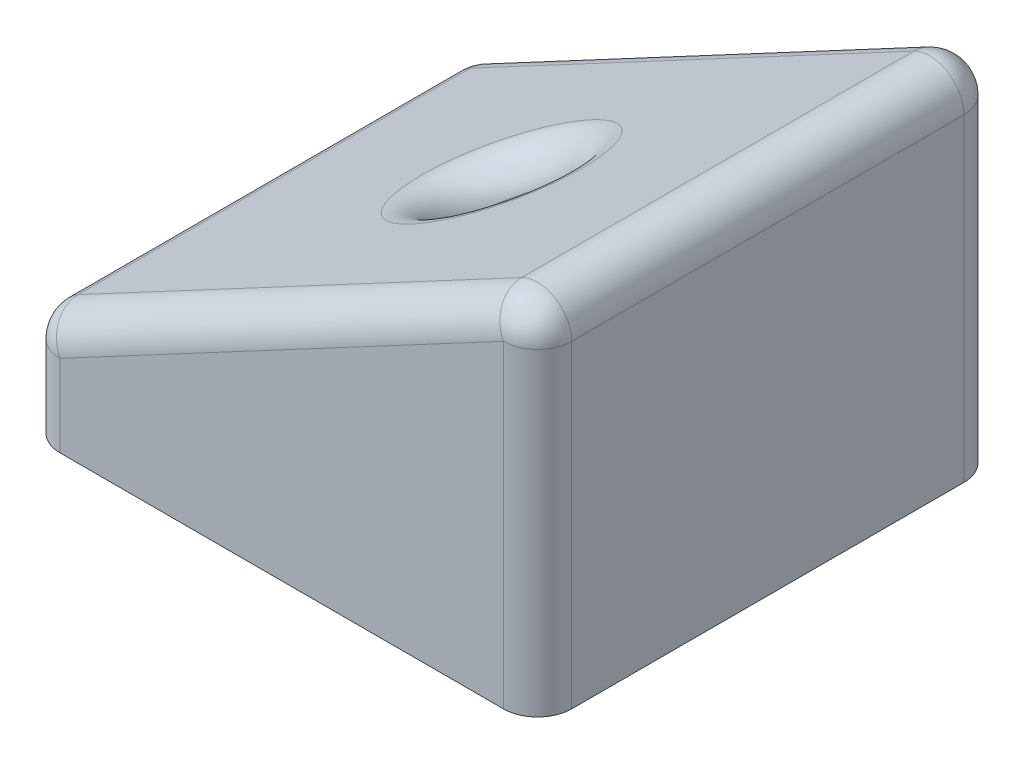
ISO-10303-21;
HEADER;
FILE_DESCRIPTION(('STEP AP214'),'2;1');
FILE_NAME('part.step','',(''),(''),'','','');
FILE_SCHEMA(('AUTOMOTIVE_DESIGN { 1 0 10303 214 1 1 1 1 }'));
ENDSEC;
DATA;
#1=APPLICATION_CONTEXT('core data for automotive mechanical design processes');
#2=APPLICATION_PROTOCOL_DEFINITION('international standard','automotive_design',2000,#1);
#3=PRODUCT_CONTEXT('',#1,'mechanical');
#4=PRODUCT('Part','Part','',(#3));
#5=PRODUCT_RELATED_PRODUCT_CATEGORY('part','',(#4));
#6=PRODUCT_DEFINITION_FORMATION('','',#4);
#7=PRODUCT_DEFINITION_CONTEXT('part definition',#1,'design');
#8=PRODUCT_DEFINITION('design','',#6,#7);
#9=PRODUCT_DEFINITION_SHAPE('','',#8);
#10=(LENGTH_UNIT() NAMED_UNIT(*) SI_UNIT(.MILLI.,.METRE.));
#11=(NAMED_UNIT(*) PLANE_ANGLE_UNIT() SI_UNIT($,.RADIAN.));
#12=(NAMED_UNIT(*) SI_UNIT($,.STERADIAN.) SOLID_ANGLE_UNIT());
#13=UNCERTAINTY_MEASURE_WITH_UNIT(LENGTH_MEASURE(1.E-05),#10,'distance_accuracy_value','');
#14=(GEOMETRIC_REPRESENTATION_CONTEXT(3) GLOBAL_UNCERTAINTY_ASSIGNED_CONTEXT((#13)) GLOBAL_UNIT_ASSIGNED_CONTEXT((#10,
#11,#12)) REPRESENTATION_CONTEXT('',''));
#15=CARTESIAN_POINT('',(0.,0.,0.));
#16=DIRECTION('',(0.,0.,1.));
#17=DIRECTION('',(1.,0.,0.));
#18=AXIS2_PLACEMENT_3D('',#15,#16,#17);
#19=CARTESIAN_POINT('',(23.4405380236702,-3.49837972070925,7.81491618480756));
#20=DIRECTION('',(0.,0.,-1.));
#21=DIRECTION('',(-1.,0.,0.));
#22=AXIS2_PLACEMENT_3D('',#19,#20,#21);
#23=PLANE('',#22);
#24=DIRECTION('',(0.882352941176471,0.470588235294118,0.));
#25=VECTOR('',#24,1.);
#26=CARTESIAN_POINT('',(18.0702958091373,6.57082443153988,7.81491618480756));
#27=LINE('',#26,#25);
#28=CARTESIAN_POINT('',(15.1077446567349,4.9907971502586,7.81491618480757));
#29=VERTEX_POINT('',#28);
#30=CARTESIAN_POINT('',(21.0328469615397,8.15085171282116,7.81491618480756));
#31=VERTEX_POINT('',#30);
#32=EDGE_CURVE('E157',#29,#31,#27,.T.);
#33=ORIENTED_EDGE('',*,*,#32,.F.);
#34=DIRECTION('',(-0.470588235294118,0.882352941176471,0.));
#35=VECTOR('',#34,1.);
#36=CARTESIAN_POINT('',(20.4779868712677,-5.07840700199054,7.81491618480757));
#37=LINE('',#36,#35);
#38=CARTESIAN_POINT('',(17.7695031368728,0.,7.81491618480757));
#39=VERTEX_POINT('',#38);
#40=EDGE_CURVE('E146',#39,#29,#37,.T.);
#41=ORIENTED_EDGE('',*,*,#40,.F.);
#42=DIRECTION('',(-1.,0.,0.));
#43=VECTOR('',#42,1.);
#44=CARTESIAN_POINT('',(0.,0.,7.81491618480752));
#45=LINE('',#44,#43);
#46=CARTESIAN_POINT('',(25.3799678750443,0.,7.81491618480756));
#47=VERTEX_POINT('',#46);
#48=EDGE_CURVE('E292',#47,#39,#45,.T.);
#49=ORIENTED_EDGE('',*,*,#48,.F.);
#50=DIRECTION('',(-0.470588235294118,0.882352941176471,0.));
#51=VECTOR('',#50,1.);
#52=CARTESIAN_POINT('',(26.4030891760726,-1.91835243942797,7.81491618480756));
#53=LINE('',#52,#51);
#54=EDGE_CURVE('E162',#47,#31,#53,.T.);
#55=ORIENTED_EDGE('',*,*,#54,.T.);
#56=EDGE_LOOP('',(#33,#41,#49,#55));
#57=FACE_BOUND('',#56,.T.);
#58=ADVANCED_FACE('F33',(#57),#23,.F.);
#59=CARTESIAN_POINT('',(26.4030891760726,-1.91835243942797,7.81491618480756));
#60=DIRECTION('',(0.764140062162739,0.407541366486794,-0.500000000000002));
#61=DIRECTION('',(-0.547533132440708,0.,-0.836784003718801));
#62=AXIS2_PLACEMENT_3D('',#59,#60,#61);
#63=PLANE('',#62);
#64=DIRECTION('',(0.441176470588237,0.23529411764706,0.866025403784437));
#65=VECTOR('',#64,1.);
#66=CARTESIAN_POINT('',(21.0328469615397,8.15085171282116,7.81491618480756));
#67=LINE('',#66,#65);
#68=CARTESIAN_POINT('',(23.8856365262666,9.67233948067552,13.4149161834714));
#69=VERTEX_POINT('',#68);
#70=EDGE_CURVE('E165',#31,#69,#67,.T.);
#71=ORIENTED_EDGE('',*,*,#70,.F.);
#72=ORIENTED_EDGE('',*,*,#54,.F.);
#73=DIRECTION('',(-0.547533132440708,0.,-0.836784003718801));
#74=VECTOR('',#73,1.);
#75=CARTESIAN_POINT('',(14.1907066223705,0.,-9.28540939353889));
#76=LINE('',#75,#74);
#77=CARTESIAN_POINT('',(29.0442175826269,0.,13.4149161834714));
#78=VERTEX_POINT('',#77);
#79=EDGE_CURVE('E289',#78,#47,#76,.T.);
#80=ORIENTED_EDGE('',*,*,#79,.F.);
#81=DIRECTION('',(-0.470588235294118,0.882352941176471,0.));
#82=VECTOR('',#81,1.);
#83=CARTESIAN_POINT('',(29.2558787407995,-0.396864671573609,13.4149161834715));
#84=LINE('',#83,#82);
#85=EDGE_CURVE('E269',#78,#69,#84,.T.);
#86=ORIENTED_EDGE('',*,*,#85,.T.);
#87=EDGE_LOOP('',(#71,#72,#80,#86));
#88=FACE_BOUND('',#87,.T.);
#89=ADVANCED_FACE('F342',(#88),#63,.F.);
#90=CARTESIAN_POINT('',(26.4030891760726,-1.91835243942796,19.0149161821354));
#91=DIRECTION('',(0.764140062162741,0.407541366486795,0.499999999999998));
#92=DIRECTION('',(0.547533132440704,0.,-0.836784003718804));
#93=AXIS2_PLACEMENT_3D('',#90,#91,#92);
#94=PLANE('',#93);
#95=DIRECTION('',(-0.441176470588233,-0.235294117647058,0.86602540378444));
#96=VECTOR('',#95,1.);
#97=CARTESIAN_POINT('',(21.0328469615397,8.15085171282117,19.0149161821354));
#98=LINE('',#97,#96);
#99=CARTESIAN_POINT('',(21.0328469615397,8.15085171282117,19.0149161821354));
#100=VERTEX_POINT('',#99);
#101=EDGE_CURVE('E264',#69,#100,#98,.T.);
#102=ORIENTED_EDGE('',*,*,#101,.F.);
#103=ORIENTED_EDGE('',*,*,#85,.F.);
#104=DIRECTION('',(0.547533132440704,0.,-0.836784003718804));
#105=VECTOR('',#104,1.);
#106=CARTESIAN_POINT('',(26.4832495358725,0.,17.3287927483588));
#107=LINE('',#106,#105);
#108=CARTESIAN_POINT('',(25.3799678750443,0.,19.0149161821354));
#109=VERTEX_POINT('',#108);
#110=EDGE_CURVE('E286',#109,#78,#107,.T.);
#111=ORIENTED_EDGE('',*,*,#110,.F.);
#112=DIRECTION('',(-0.470588235294118,0.882352941176471,0.));
#113=VECTOR('',#112,1.);
#114=CARTESIAN_POINT('',(26.4030891760726,-1.91835243942796,19.0149161821354));
#115=LINE('',#114,#113);
#116=EDGE_CURVE('E272',#109,#100,#115,.T.);
#117=ORIENTED_EDGE('',*,*,#116,.T.);
#118=EDGE_LOOP('',(#102,#103,#111,#117));
#119=FACE_BOUND('',#118,.T.);
#120=ADVANCED_FACE('F347',(#119),#94,.F.);
#121=CARTESIAN_POINT('',(23.4405380236701,-3.49837972070926,19.0149161821354));
#122=DIRECTION('',(0.,0.,1.));
#123=DIRECTION('',(1.,0.,0.));
#124=AXIS2_PLACEMENT_3D('',#121,#122,#123);
#125=PLANE('',#124);
#126=DIRECTION('',(-0.882352941176471,-0.470588235294118,0.));
#127=VECTOR('',#126,1.);
#128=CARTESIAN_POINT('',(18.0702958091373,6.57082443153987,19.0149161821354));
#129=LINE('',#128,#127);
#130=CARTESIAN_POINT('',(15.1077446567349,4.9907971502586,19.0149161821354));
#131=VERTEX_POINT('',#130);
#132=EDGE_CURVE('E260',#100,#131,#129,.T.);
#133=ORIENTED_EDGE('',*,*,#132,.F.);
#134=ORIENTED_EDGE('',*,*,#116,.F.);
#135=DIRECTION('',(1.,0.,0.));
#136=VECTOR('',#135,1.);
#137=CARTESIAN_POINT('',(0.,0.,19.0149161821354));
#138=LINE('',#137,#136);
#139=CARTESIAN_POINT('',(17.7695031368728,0.,19.0149161821354));
#140=VERTEX_POINT('',#139);
#141=EDGE_CURVE('E283',#140,#109,#138,.T.);
#142=ORIENTED_EDGE('',*,*,#141,.F.);
#143=DIRECTION('',(-0.470588235294118,0.882352941176471,0.));
#144=VECTOR('',#143,1.);
#145=CARTESIAN_POINT('',(20.4779868712677,-5.07840700199053,19.0149161821354));
#146=LINE('',#145,#144);
#147=EDGE_CURVE('E275',#140,#131,#146,.T.);
#148=ORIENTED_EDGE('',*,*,#147,.T.);
#149=EDGE_LOOP('',(#133,#134,#142,#148));
#150=FACE_BOUND('',#149,.T.);
#151=ADVANCED_FACE('F355',(#150),#125,.F.);
#152=CARTESIAN_POINT('',(20.4779868712677,-5.07840700199053,19.0149161821354));
#153=DIRECTION('',(-0.764140062162741,-0.407541366486795,0.499999999999998));
#154=DIRECTION('',(0.547533132440704,0.,0.836784003718804));
#155=AXIS2_PLACEMENT_3D('',#152,#153,#154);
#156=PLANE('',#155);
#157=DIRECTION('',(-0.441176470588233,-0.235294117647058,-0.86602540378444));
#158=VECTOR('',#157,1.);
#159=CARTESIAN_POINT('',(15.1077446567349,4.9907971502586,19.0149161821354));
#160=LINE('',#159,#158);
#161=CARTESIAN_POINT('',(12.254955092008,3.46930938240424,13.4149161834715));
#162=VERTEX_POINT('',#161);
#163=EDGE_CURVE('E170',#131,#162,#160,.T.);
#164=ORIENTED_EDGE('',*,*,#163,.F.);
#165=ORIENTED_EDGE('',*,*,#147,.F.);
#166=DIRECTION('',(0.547533132440704,0.,0.836784003718804));
#167=VECTOR('',#166,1.);
#168=CARTESIAN_POINT('',(3.7303323448787,0.,-2.44086950128013));
#169=LINE('',#168,#167);
#170=CARTESIAN_POINT('',(14.1052534292902,0.,13.4149161834715));
#171=VERTEX_POINT('',#170);
#172=EDGE_CURVE('E280',#171,#140,#169,.T.);
#173=ORIENTED_EDGE('',*,*,#172,.F.);
#174=DIRECTION('',(-0.470588235294118,0.882352941176471,0.));
#175=VECTOR('',#174,1.);
#176=CARTESIAN_POINT('',(17.6251973065408,-6.59989476984489,13.4149161834715));
#177=LINE('',#176,#175);
#178=EDGE_CURVE('E156',#171,#162,#177,.T.);
#179=ORIENTED_EDGE('',*,*,#178,.T.);
#180=EDGE_LOOP('',(#164,#165,#173,#179));
#181=FACE_BOUND('',#180,.T.);
#182=ADVANCED_FACE('F359',(#181),#156,.F.);
#183=CARTESIAN_POINT('',(20.4779868712677,-5.07840700199054,7.81491618480757));
#184=DIRECTION('',(-0.76414006216274,-0.407541366486795,-0.5));
#185=DIRECTION('',(-0.547533132440706,0.,0.836784003718802));
#186=AXIS2_PLACEMENT_3D('',#183,#184,#185);
#187=PLANE('',#186);
#188=DIRECTION('',(0.441176470588235,0.235294117647059,-0.866025403784439));
#189=VECTOR('',#188,1.);
#190=CARTESIAN_POINT('',(15.1077446567349,4.9907971502586,7.81491618480757));
#191=LINE('',#190,#189);
#192=EDGE_CURVE('E150',#162,#29,#191,.T.);
#193=ORIENTED_EDGE('',*,*,#192,.F.);
#194=ORIENTED_EDGE('',*,*,#178,.F.);
#195=DIRECTION('',(-0.547533132440706,0.,0.836784003718802));
#196=VECTOR('',#195,1.);
#197=CARTESIAN_POINT('',(16.0228752583805,0.,10.4842528561001));
#198=LINE('',#197,#196);
#199=EDGE_CURVE('E153',#39,#171,#198,.T.);
#200=ORIENTED_EDGE('',*,*,#199,.F.);
#201=ORIENTED_EDGE('',*,*,#40,.T.);
#202=EDGE_LOOP('',(#193,#194,#200,#201));
#203=FACE_BOUND('',#202,.T.);
#204=ADVANCED_FACE('F148',(#203),#187,.F.);
#205=CARTESIAN_POINT('',(0.,22.,0.));
#206=DIRECTION('',(1.,0.,0.));
#207=DIRECTION('',(0.,0.,-1.));
#208=AXIS2_PLACEMENT_3D('',#205,#206,#207);
#209=PLANE('',#208);
#210=DIRECTION('',(0.,0.,1.));
#211=VECTOR('',#210,1.);
#212=CARTESIAN_POINT('',(0.,4.8,0.));
#213=LINE('',#212,#211);
#214=CARTESIAN_POINT('',(0.,4.8,25.));
#215=VERTEX_POINT('',#214);
#216=CARTESIAN_POINT('',(0.,4.8,2.));
#217=VERTEX_POINT('',#216);
#218=EDGE_CURVE('E195',#215,#217,#213,.F.);
#219=ORIENTED_EDGE('',*,*,#218,.T.);
#220=DIRECTION('',(0.,-1.,0.));
#221=VECTOR('',#220,1.);
#222=CARTESIAN_POINT('',(0.,22.,2.));
#223=LINE('',#222,#221);
#224=CARTESIAN_POINT('',(0.,0.,2.));
#225=VERTEX_POINT('',#224);
#226=EDGE_CURVE('E198',#217,#225,#223,.T.);
#227=ORIENTED_EDGE('',*,*,#226,.T.);
#228=DIRECTION('',(0.,0.,1.));
#229=VECTOR('',#228,1.);
#230=CARTESIAN_POINT('',(0.,0.,0.));
#231=LINE('',#230,#229);
#232=CARTESIAN_POINT('',(0.,0.,25.));
#233=VERTEX_POINT('',#232);
#234=EDGE_CURVE('E294',#225,#233,#231,.T.);
#235=ORIENTED_EDGE('',*,*,#234,.T.);
#236=DIRECTION('',(0.,-1.,0.));
#237=VECTOR('',#236,1.);
#238=CARTESIAN_POINT('',(0.,22.,25.));
#239=LINE('',#238,#237);
#240=EDGE_CURVE('E193',#233,#215,#239,.F.);
#241=ORIENTED_EDGE('',*,*,#240,.T.);
#242=EDGE_LOOP('',(#219,#227,#235,#241));
#243=FACE_BOUND('',#242,.T.);
#244=ADVANCED_FACE('F366',(#243),#209,.F.);
#245=CARTESIAN_POINT('',(0.,22.,27.));
#246=DIRECTION('',(0.,0.,-1.));
#247=DIRECTION('',(-1.,0.,0.));
#248=AXIS2_PLACEMENT_3D('',#245,#246,#247);
#249=PLANE('',#248);
#250=DIRECTION('',(0.882352941176471,0.470588235294118,0.));
#251=VECTOR('',#250,1.);
#252=CARTESIAN_POINT('',(7.58477508650519,7.77854671280277,27.));
#253=LINE('',#252,#251);
#254=CARTESIAN_POINT('',(28.,18.6666666666667,27.));
#255=VERTEX_POINT('',#254);
#256=CARTESIAN_POINT('',(2.,4.8,27.));
#257=VERTEX_POINT('',#256);
#258=EDGE_CURVE('E50',#255,#257,#253,.F.);
#259=ORIENTED_EDGE('',*,*,#258,.T.);
#260=DIRECTION('',(0.,-1.,0.));
#261=VECTOR('',#260,1.);
#262=CARTESIAN_POINT('',(2.,22.,27.));
#263=LINE('',#262,#261);
#264=CARTESIAN_POINT('',(2.,0.,27.));
#265=VERTEX_POINT('',#264);
#266=EDGE_CURVE('E214',#257,#265,#263,.T.);
#267=ORIENTED_EDGE('',*,*,#266,.T.);
#268=DIRECTION('',(1.,0.,0.));
#269=VECTOR('',#268,1.);
#270=CARTESIAN_POINT('',(0.,0.,27.));
#271=LINE('',#270,#269);
#272=CARTESIAN_POINT('',(28.,0.,27.));
#273=VERTEX_POINT('',#272);
#274=EDGE_CURVE('E297',#265,#273,#271,.T.);
#275=ORIENTED_EDGE('',*,*,#274,.T.);
#276=DIRECTION('',(0.,-1.,0.));
#277=VECTOR('',#276,1.);
#278=CARTESIAN_POINT('',(28.,22.,27.));
#279=LINE('',#278,#277);
#280=EDGE_CURVE('E55',#273,#255,#279,.F.);
#281=ORIENTED_EDGE('',*,*,#280,.T.);
#282=EDGE_LOOP('',(#259,#267,#275,#281));
#283=FACE_BOUND('',#282,.T.);
#284=ADVANCED_FACE('F378',(#283),#249,.F.);
#285=CARTESIAN_POINT('',(30.,22.,0.));
#286=DIRECTION('',(-1.,0.,0.));
#287=DIRECTION('',(0.,0.,1.));
#288=AXIS2_PLACEMENT_3D('',#285,#286,#287);
#289=PLANE('',#288);
#290=DIRECTION('',(0.,0.,-1.));
#291=VECTOR('',#290,1.);
#292=CARTESIAN_POINT('',(30.,18.6666666666667,0.));
#293=LINE('',#292,#291);
#294=CARTESIAN_POINT('',(30.,18.6666666666667,2.));
#295=VERTEX_POINT('',#294);
#296=CARTESIAN_POINT('',(30.,18.6666666666667,25.));
#297=VERTEX_POINT('',#296);
#298=EDGE_CURVE('E208',#295,#297,#293,.F.);
#299=ORIENTED_EDGE('',*,*,#298,.T.);
#300=DIRECTION('',(0.,-1.,0.));
#301=VECTOR('',#300,1.);
#302=CARTESIAN_POINT('',(30.,22.,25.));
#303=LINE('',#302,#301);
#304=CARTESIAN_POINT('',(30.,0.,25.));
#305=VERTEX_POINT('',#304);
#306=EDGE_CURVE('E210',#297,#305,#303,.T.);
#307=ORIENTED_EDGE('',*,*,#306,.T.);
#308=DIRECTION('',(0.,0.,-1.));
#309=VECTOR('',#308,1.);
#310=CARTESIAN_POINT('',(30.,0.,0.));
#311=LINE('',#310,#309);
#312=CARTESIAN_POINT('',(30.,0.,2.));
#313=VERTEX_POINT('',#312);
#314=EDGE_CURVE('E178',#305,#313,#311,.T.);
#315=ORIENTED_EDGE('',*,*,#314,.T.);
#316=DIRECTION('',(0.,-1.,0.));
#317=VECTOR('',#316,1.);
#318=CARTESIAN_POINT('',(30.,22.,2.));
#319=LINE('',#318,#317);
#320=EDGE_CURVE('E206',#313,#295,#319,.F.);
#321=ORIENTED_EDGE('',*,*,#320,.T.);
#322=EDGE_LOOP('',(#299,#307,#315,#321));
#323=FACE_BOUND('',#322,.T.);
#324=ADVANCED_FACE('F302',(#323),#289,.F.);
#325=CARTESIAN_POINT('',(0.,22.,0.));
#326=DIRECTION('',(0.,0.,1.));
#327=DIRECTION('',(1.,0.,0.));
#328=AXIS2_PLACEMENT_3D('',#325,#326,#327);
#329=PLANE('',#328);
#330=DIRECTION('',(-1.,0.,0.));
#331=VECTOR('',#330,1.);
#332=CARTESIAN_POINT('',(0.,0.,0.));
#333=LINE('',#332,#331);
#334=CARTESIAN_POINT('',(28.,0.,0.));
#335=VERTEX_POINT('',#334);
#336=CARTESIAN_POINT('',(2.,0.,0.));
#337=VERTEX_POINT('',#336);
#338=EDGE_CURVE('E172',#335,#337,#333,.T.);
#339=ORIENTED_EDGE('',*,*,#338,.T.);
#340=DIRECTION('',(0.,-1.,0.));
#341=VECTOR('',#340,1.);
#342=CARTESIAN_POINT('',(2.,22.,0.));
#343=LINE('',#342,#341);
#344=CARTESIAN_POINT('',(2.,4.8,0.));
#345=VERTEX_POINT('',#344);
#346=EDGE_CURVE('E204',#337,#345,#343,.F.);
#347=ORIENTED_EDGE('',*,*,#346,.T.);
#348=DIRECTION('',(0.882352941176471,0.470588235294118,0.));
#349=VECTOR('',#348,1.);
#350=CARTESIAN_POINT('',(7.58477508650519,7.77854671280277,0.));
#351=LINE('',#350,#349);
#352=CARTESIAN_POINT('',(28.,18.6666666666667,0.));
#353=VERTEX_POINT('',#352);
#354=EDGE_CURVE('E202',#345,#353,#351,.T.);
#355=ORIENTED_EDGE('',*,*,#354,.T.);
#356=DIRECTION('',(0.,-1.,0.));
#357=VECTOR('',#356,1.);
#358=CARTESIAN_POINT('',(28.,22.,0.));
#359=LINE('',#358,#357);
#360=EDGE_CURVE('E200',#353,#335,#359,.T.);
#361=ORIENTED_EDGE('',*,*,#360,.T.);
#362=EDGE_LOOP('',(#339,#347,#355,#361));
#363=FACE_BOUND('',#362,.T.);
#364=ADVANCED_FACE('F312',(#363),#329,.F.);
#365=CARTESIAN_POINT('',(0.,0.,0.));
#366=DIRECTION('',(0.,1.,0.));
#367=DIRECTION('',(0.,0.,1.));
#368=AXIS2_PLACEMENT_3D('',#365,#366,#367);
#369=PLANE('',#368);
#370=ORIENTED_EDGE('',*,*,#79,.T.);
#371=ORIENTED_EDGE('',*,*,#48,.T.);
#372=ORIENTED_EDGE('',*,*,#199,.T.);
#373=ORIENTED_EDGE('',*,*,#172,.T.);
#374=ORIENTED_EDGE('',*,*,#141,.T.);
#375=ORIENTED_EDGE('',*,*,#110,.T.);
#376=EDGE_LOOP('',(#370,#371,#372,#373,#374,#375));
#377=FACE_BOUND('',#376,.T.);
#378=ORIENTED_EDGE('',*,*,#234,.F.);
#379=CARTESIAN_POINT('',(2.,0.,2.));
#380=DIRECTION('',(0.,1.,0.));
#381=DIRECTION('',(0.,0.,1.));
#382=AXIS2_PLACEMENT_3D('',#379,#380,#381);
#383=CIRCLE('',#382,2.);
#384=EDGE_CURVE('E11',#225,#337,#383,.F.);
#385=ORIENTED_EDGE('',*,*,#384,.T.);
#386=ORIENTED_EDGE('',*,*,#338,.F.);
#387=CARTESIAN_POINT('',(28.,0.,2.));
#388=DIRECTION('',(0.,1.,0.));
#389=DIRECTION('',(0.,0.,1.));
#390=AXIS2_PLACEMENT_3D('',#387,#388,#389);
#391=CIRCLE('',#390,2.);
#392=EDGE_CURVE('E216',#335,#313,#391,.F.);
#393=ORIENTED_EDGE('',*,*,#392,.T.);
#394=ORIENTED_EDGE('',*,*,#314,.F.);
#395=CARTESIAN_POINT('',(28.,0.,25.));
#396=DIRECTION('',(0.,1.,0.));
#397=DIRECTION('',(0.,0.,1.));
#398=AXIS2_PLACEMENT_3D('',#395,#396,#397);
#399=CIRCLE('',#398,2.);
#400=EDGE_CURVE('E218',#305,#273,#399,.F.);
#401=ORIENTED_EDGE('',*,*,#400,.T.);
#402=ORIENTED_EDGE('',*,*,#274,.F.);
#403=CARTESIAN_POINT('',(2.,0.,25.));
#404=DIRECTION('',(0.,1.,0.));
#405=DIRECTION('',(0.,0.,1.));
#406=AXIS2_PLACEMENT_3D('',#403,#404,#405);
#407=CIRCLE('',#406,2.);
#408=EDGE_CURVE('E42',#265,#233,#407,.F.);
#409=ORIENTED_EDGE('',*,*,#408,.T.);
#410=EDGE_LOOP('',(#378,#385,#386,#393,#394,#401,#402,#409));
#411=FACE_BOUND('',#410,.T.);
#412=ADVANCED_FACE('F316',(#377,#411),#369,.F.);
#413=CARTESIAN_POINT('',(0.,6.,0.));
#414=DIRECTION('',(0.470588235294118,-0.882352941176471,0.));
#415=DIRECTION('',(0.882352941176471,0.470588235294118,0.));
#416=AXIS2_PLACEMENT_3D('',#413,#414,#415);
#417=PLANE('',#416);
#418=CARTESIAN_POINT('',(14.3055899267843,13.6296479609516,13.4149161834715));
#419=DIRECTION('',(0.470588235294118,-0.882352941176471,0.));
#420=DIRECTION('',(0.882352941176471,0.470588235294118,0.));
#421=AXIS2_PLACEMENT_3D('',#418,#419,#420);
#422=CIRCLE('',#421,5.3);
#423=CARTESIAN_POINT('',(18.9820605150196,16.1237656080105,13.4149161834715));
#424=VERTEX_POINT('',#423);
#425=EDGE_CURVE('E190',#424,#424,#422,.T.);
#426=ORIENTED_EDGE('',*,*,#425,.T.);
#427=EDGE_LOOP('',(#426));
#428=FACE_BOUND('',#427,.T.);
#429=DIRECTION('',(0.882352941176471,0.470588235294118,0.));
#430=VECTOR('',#429,1.);
#431=CARTESIAN_POINT('',(0.,6.,2.));
#432=LINE('',#431,#430);
#433=CARTESIAN_POINT('',(27.0588235294118,20.4313725490196,2.));
#434=VERTEX_POINT('',#433);
#435=CARTESIAN_POINT('',(1.05882352941176,6.56470588235294,2.));
#436=VERTEX_POINT('',#435);
#437=EDGE_CURVE('E185',#434,#436,#432,.F.);
#438=ORIENTED_EDGE('',*,*,#437,.T.);
#439=DIRECTION('',(0.,0.,1.));
#440=VECTOR('',#439,1.);
#441=CARTESIAN_POINT('',(1.05882352941176,6.56470588235294,0.));
#442=LINE('',#441,#440);
#443=CARTESIAN_POINT('',(1.05882352941177,6.56470588235294,25.));
#444=VERTEX_POINT('',#443);
#445=EDGE_CURVE('E187',#436,#444,#442,.T.);
#446=ORIENTED_EDGE('',*,*,#445,.T.);
#447=DIRECTION('',(0.882352941176471,0.470588235294118,0.));
#448=VECTOR('',#447,1.);
#449=CARTESIAN_POINT('',(0.,6.,25.));
#450=LINE('',#449,#448);
#451=CARTESIAN_POINT('',(27.0588235294118,20.4313725490196,25.));
#452=VERTEX_POINT('',#451);
#453=EDGE_CURVE('E175',#444,#452,#450,.T.);
#454=ORIENTED_EDGE('',*,*,#453,.T.);
#455=DIRECTION('',(0.,0.,-1.));
#456=VECTOR('',#455,1.);
#457=CARTESIAN_POINT('',(27.0588235294118,20.4313725490196,0.));
#458=LINE('',#457,#456);
#459=EDGE_CURVE('E183',#452,#434,#458,.T.);
#460=ORIENTED_EDGE('',*,*,#459,.T.);
#461=EDGE_LOOP('',(#438,#446,#454,#460));
#462=FACE_BOUND('',#461,.T.);
#463=ADVANCED_FACE('F367',(#428,#462),#417,.F.);
#464=CARTESIAN_POINT('',(18.0702958091373,6.57082443153988,13.4149161834715));
#465=DIRECTION('',(-0.470588235294118,0.882352941176471,0.));
#466=DIRECTION('',(-0.882352941176471,-0.470588235294118,0.));
#467=AXIS2_PLACEMENT_3D('',#464,#465,#466);
#468=PLANE('',#467);
#469=CARTESIAN_POINT('',(18.0702958091373,6.57082443153988,13.4149161834715));
#470=DIRECTION('',(-0.470588235294118,0.882352941176471,0.));
#471=DIRECTION('',(-0.882352941176471,-0.470588235294118,0.));
#472=AXIS2_PLACEMENT_3D('',#469,#470,#471);
#473=CIRCLE('',#472,3.3);
#474=CARTESIAN_POINT('',(15.1585311032549,5.01788325506929,13.4149161834715));
#475=VERTEX_POINT('',#474);
#476=EDGE_CURVE('E254',#475,#475,#473,.T.);
#477=ORIENTED_EDGE('',*,*,#476,.T.);
#478=EDGE_LOOP('',(#477));
#479=FACE_BOUND('',#478,.T.);
#480=ORIENTED_EDGE('',*,*,#192,.T.);
#481=ORIENTED_EDGE('',*,*,#32,.T.);
#482=ORIENTED_EDGE('',*,*,#70,.T.);
#483=ORIENTED_EDGE('',*,*,#101,.T.);
#484=ORIENTED_EDGE('',*,*,#132,.T.);
#485=ORIENTED_EDGE('',*,*,#163,.T.);
#486=EDGE_LOOP('',(#480,#481,#482,#483,#484,#485));
#487=FACE_BOUND('',#486,.T.);
#488=ADVANCED_FACE('F168',(#479,#487),#468,.F.);
#489=CARTESIAN_POINT('',(18.0702958091373,6.57082443153988,13.4149161834715));
#490=DIRECTION('',(-0.470588235294118,0.882352941176471,0.));
#491=DIRECTION('',(-0.882352941176471,-0.470588235294118,0.));
#492=AXIS2_PLACEMENT_3D('',#489,#490,#491);
#493=CYLINDRICAL_SURFACE('',#492,3.3);
#494=CARTESIAN_POINT('',(15.2467663973726,11.8649420785987,13.4149161834715));
#495=DIRECTION('',(0.470588235294118,-0.882352941176471,0.));
#496=DIRECTION('',(0.882352941176471,0.470588235294118,0.));
#497=AXIS2_PLACEMENT_3D('',#494,#495,#496);
#498=CIRCLE('',#497,3.3);
#499=CARTESIAN_POINT('',(18.1585311032549,13.4178832550693,13.4149161834715));
#500=VERTEX_POINT('',#499);
#501=EDGE_CURVE('E171',#500,#500,#498,.F.);
#502=ORIENTED_EDGE('',*,*,#501,.T.);
#503=EDGE_LOOP('',(#502));
#504=FACE_BOUND('',#503,.T.);
#505=ORIENTED_EDGE('',*,*,#476,.F.);
#506=EDGE_LOOP('',(#505));
#507=FACE_BOUND('',#506,.T.);
#508=ADVANCED_FACE('F387',(#504,#507),#493,.F.);
#509=CARTESIAN_POINT('',(15.2467663973726,11.8649420785987,13.4149161834715));
#510=DIRECTION('',(0.470588235294118,-0.882352941176471,0.));
#511=DIRECTION('',(0.882352941176471,0.470588235294118,0.));
#512=AXIS2_PLACEMENT_3D('',#509,#510,#511);
#513=TOROIDAL_SURFACE('',#512,5.3,2.);
#514=ORIENTED_EDGE('',*,*,#425,.F.);
#515=EDGE_LOOP('',(#514));
#516=FACE_BOUND('',#515,.T.);
#517=ORIENTED_EDGE('',*,*,#501,.F.);
#518=EDGE_LOOP('',(#517));
#519=FACE_BOUND('',#518,.T.);
#520=ADVANCED_FACE('F384',(#516,#519),#513,.T.);
#521=CARTESIAN_POINT('',(28.,22.,2.));
#522=DIRECTION('',(0.,-1.,0.));
#523=DIRECTION('',(0.,0.,-1.));
#524=AXIS2_PLACEMENT_3D('',#521,#522,#523);
#525=CYLINDRICAL_SURFACE('',#524,2.);
#526=ORIENTED_EDGE('',*,*,#392,.F.);
#527=ORIENTED_EDGE('',*,*,#360,.F.);
#528=CARTESIAN_POINT('',(28.,18.6666666666667,2.));
#529=DIRECTION('',(0.,1.,0.));
#530=DIRECTION('',(0.,0.,1.));
#531=AXIS2_PLACEMENT_3D('',#528,#529,#530);
#532=CIRCLE('',#531,2.);
#533=EDGE_CURVE('E37',#295,#353,#532,.T.);
#534=ORIENTED_EDGE('',*,*,#533,.F.);
#535=ORIENTED_EDGE('',*,*,#320,.F.);
#536=EDGE_LOOP('',(#526,#527,#534,#535));
#537=FACE_BOUND('',#536,.T.);
#538=ADVANCED_FACE('F35',(#537),#525,.T.);
#539=CARTESIAN_POINT('',(28.,18.6666666666667,0.));
#540=DIRECTION('',(0.,0.,-1.));
#541=DIRECTION('',(-1.,0.,0.));
#542=AXIS2_PLACEMENT_3D('',#539,#540,#541);
#543=CYLINDRICAL_SURFACE('',#542,2.);
#544=CARTESIAN_POINT('',(28.,18.6666666666667,25.));
#545=DIRECTION('',(0.,0.,1.));
#546=DIRECTION('',(1.,0.,0.));
#547=AXIS2_PLACEMENT_3D('',#544,#545,#546);
#548=CIRCLE('',#547,2.);
#549=EDGE_CURVE('E246',#297,#452,#548,.T.);
#550=ORIENTED_EDGE('',*,*,#549,.F.);
#551=ORIENTED_EDGE('',*,*,#298,.F.);
#552=CARTESIAN_POINT('',(28.,18.6666666666667,2.));
#553=DIRECTION('',(0.,0.,-1.));
#554=DIRECTION('',(-1.,0.,0.));
#555=AXIS2_PLACEMENT_3D('',#552,#553,#554);
#556=CIRCLE('',#555,2.);
#557=EDGE_CURVE('E248',#434,#295,#556,.T.);
#558=ORIENTED_EDGE('',*,*,#557,.F.);
#559=ORIENTED_EDGE('',*,*,#459,.F.);
#560=EDGE_LOOP('',(#550,#551,#558,#559));
#561=FACE_BOUND('',#560,.T.);
#562=ADVANCED_FACE('F338',(#561),#543,.T.);
#563=CARTESIAN_POINT('',(28.,22.,25.));
#564=DIRECTION('',(0.,-1.,0.));
#565=DIRECTION('',(0.,0.,-1.));
#566=AXIS2_PLACEMENT_3D('',#563,#564,#565);
#567=CYLINDRICAL_SURFACE('',#566,2.);
#568=ORIENTED_EDGE('',*,*,#400,.F.);
#569=ORIENTED_EDGE('',*,*,#306,.F.);
#570=CARTESIAN_POINT('',(28.,18.6666666666667,25.));
#571=DIRECTION('',(0.,1.,0.));
#572=DIRECTION('',(-1.,0.,0.));
#573=AXIS2_PLACEMENT_3D('',#570,#571,#572);
#574=CIRCLE('',#573,2.);
#575=EDGE_CURVE('E243',#255,#297,#574,.T.);
#576=ORIENTED_EDGE('',*,*,#575,.F.);
#577=ORIENTED_EDGE('',*,*,#280,.F.);
#578=EDGE_LOOP('',(#568,#569,#576,#577));
#579=FACE_BOUND('',#578,.T.);
#580=ADVANCED_FACE('F330',(#579),#567,.T.);
#581=CARTESIAN_POINT('',(28.,18.6666666666667,2.));
#582=DIRECTION('',(0.,0.,1.));
#583=DIRECTION('',(1.,0.,0.));
#584=AXIS2_PLACEMENT_3D('',#581,#582,#583);
#585=SPHERICAL_SURFACE('',#584,2.);
#586=ORIENTED_EDGE('',*,*,#557,.T.);
#587=ORIENTED_EDGE('',*,*,#533,.T.);
#588=CARTESIAN_POINT('',(28.,18.6666666666667,2.));
#589=DIRECTION('',(0.88235294117647,0.470588235294119,0.));
#590=DIRECTION('',(-0.470588235294119,0.88235294117647,0.));
#591=AXIS2_PLACEMENT_3D('',#588,#589,#590);
#592=CIRCLE('',#591,2.);
#593=EDGE_CURVE('E240',#434,#353,#592,.F.);
#594=ORIENTED_EDGE('',*,*,#593,.F.);
#595=EDGE_LOOP('',(#586,#587,#594));
#596=FACE_BOUND('',#595,.T.);
#597=ADVANCED_FACE('F327',(#596),#585,.T.);
#598=CARTESIAN_POINT('',(28.,18.6666666666667,25.));
#599=DIRECTION('',(0.,0.,1.));
#600=DIRECTION('',(1.,0.,0.));
#601=AXIS2_PLACEMENT_3D('',#598,#599,#600);
#602=SPHERICAL_SURFACE('',#601,2.);
#603=ORIENTED_EDGE('',*,*,#575,.T.);
#604=ORIENTED_EDGE('',*,*,#549,.T.);
#605=CARTESIAN_POINT('',(28.,18.6666666666667,25.));
#606=DIRECTION('',(0.88235294117647,0.470588235294118,0.));
#607=DIRECTION('',(-0.470588235294118,0.88235294117647,0.));
#608=AXIS2_PLACEMENT_3D('',#605,#606,#607);
#609=CIRCLE('',#608,2.);
#610=EDGE_CURVE('E237',#255,#452,#609,.F.);
#611=ORIENTED_EDGE('',*,*,#610,.F.);
#612=EDGE_LOOP('',(#603,#604,#611));
#613=FACE_BOUND('',#612,.T.);
#614=ADVANCED_FACE('F329',(#613),#602,.T.);
#615=CARTESIAN_POINT('',(2.,22.,2.));
#616=DIRECTION('',(0.,-1.,0.));
#617=DIRECTION('',(0.,0.,-1.));
#618=AXIS2_PLACEMENT_3D('',#615,#616,#617);
#619=CYLINDRICAL_SURFACE('',#618,2.);
#620=ORIENTED_EDGE('',*,*,#384,.F.);
#621=ORIENTED_EDGE('',*,*,#226,.F.);
#622=CARTESIAN_POINT('',(2.,4.8,2.));
#623=DIRECTION('',(0.,1.,0.));
#624=DIRECTION('',(-1.,0.,0.));
#625=AXIS2_PLACEMENT_3D('',#622,#623,#624);
#626=CIRCLE('',#625,2.);
#627=EDGE_CURVE('E234',#345,#217,#626,.T.);
#628=ORIENTED_EDGE('',*,*,#627,.F.);
#629=ORIENTED_EDGE('',*,*,#346,.F.);
#630=EDGE_LOOP('',(#620,#621,#628,#629));
#631=FACE_BOUND('',#630,.T.);
#632=ADVANCED_FACE('F320',(#631),#619,.T.);
#633=CARTESIAN_POINT('',(7.58477508650519,7.77854671280277,2.));
#634=DIRECTION('',(0.882352941176471,0.470588235294118,0.));
#635=DIRECTION('',(-0.470588235294118,0.882352941176471,0.));
#636=AXIS2_PLACEMENT_3D('',#633,#634,#635);
#637=CYLINDRICAL_SURFACE('',#636,2.);
#638=ORIENTED_EDGE('',*,*,#593,.T.);
#639=ORIENTED_EDGE('',*,*,#354,.F.);
#640=CARTESIAN_POINT('',(2.,4.8,2.));
#641=DIRECTION('',(-0.88235294117647,-0.470588235294118,0.));
#642=DIRECTION('',(0.470588235294118,-0.882352941176471,0.));
#643=AXIS2_PLACEMENT_3D('',#640,#641,#642);
#644=CIRCLE('',#643,2.);
#645=EDGE_CURVE('E231',#436,#345,#644,.T.);
#646=ORIENTED_EDGE('',*,*,#645,.F.);
#647=ORIENTED_EDGE('',*,*,#437,.F.);
#648=EDGE_LOOP('',(#638,#639,#646,#647));
#649=FACE_BOUND('',#648,.T.);
#650=ADVANCED_FACE('F324',(#649),#637,.T.);
#651=CARTESIAN_POINT('',(0.941176470588235,4.23529411764706,25.));
#652=DIRECTION('',(0.882352941176471,0.470588235294118,0.));
#653=DIRECTION('',(-0.470588235294118,0.882352941176471,0.));
#654=AXIS2_PLACEMENT_3D('',#651,#652,#653);
#655=CYLINDRICAL_SURFACE('',#654,2.);
#656=ORIENTED_EDGE('',*,*,#610,.T.);
#657=ORIENTED_EDGE('',*,*,#453,.F.);
#658=CARTESIAN_POINT('',(2.,4.8,25.));
#659=DIRECTION('',(-0.882352941176471,-0.470588235294118,0.));
#660=DIRECTION('',(0.470588235294118,-0.882352941176471,0.));
#661=AXIS2_PLACEMENT_3D('',#658,#659,#660);
#662=CIRCLE('',#661,2.);
#663=EDGE_CURVE('E228',#257,#444,#662,.T.);
#664=ORIENTED_EDGE('',*,*,#663,.F.);
#665=ORIENTED_EDGE('',*,*,#258,.F.);
#666=EDGE_LOOP('',(#656,#657,#664,#665));
#667=FACE_BOUND('',#666,.T.);
#668=ADVANCED_FACE('F404',(#667),#655,.T.);
#669=CARTESIAN_POINT('',(2.,22.,25.));
#670=DIRECTION('',(0.,-1.,0.));
#671=DIRECTION('',(0.,0.,-1.));
#672=AXIS2_PLACEMENT_3D('',#669,#670,#671);
#673=CYLINDRICAL_SURFACE('',#672,2.);
#674=ORIENTED_EDGE('',*,*,#408,.F.);
#675=ORIENTED_EDGE('',*,*,#266,.F.);
#676=CARTESIAN_POINT('',(2.,4.8,25.));
#677=DIRECTION('',(0.,1.,0.));
#678=DIRECTION('',(0.,0.,1.));
#679=AXIS2_PLACEMENT_3D('',#676,#677,#678);
#680=CIRCLE('',#679,2.);
#681=EDGE_CURVE('E225',#215,#257,#680,.T.);
#682=ORIENTED_EDGE('',*,*,#681,.F.);
#683=ORIENTED_EDGE('',*,*,#240,.F.);
#684=EDGE_LOOP('',(#674,#675,#682,#683));
#685=FACE_BOUND('',#684,.T.);
#686=ADVANCED_FACE('F400',(#685),#673,.T.);
#687=CARTESIAN_POINT('',(2.,4.8,2.));
#688=DIRECTION('',(0.,0.,1.));
#689=DIRECTION('',(1.,0.,0.));
#690=AXIS2_PLACEMENT_3D('',#687,#688,#689);
#691=SPHERICAL_SURFACE('',#690,2.);
#692=ORIENTED_EDGE('',*,*,#645,.T.);
#693=ORIENTED_EDGE('',*,*,#627,.T.);
#694=CARTESIAN_POINT('',(2.,4.8,2.));
#695=DIRECTION('',(0.,0.,-1.));
#696=DIRECTION('',(-1.,0.,0.));
#697=AXIS2_PLACEMENT_3D('',#694,#695,#696);
#698=CIRCLE('',#697,2.);
#699=EDGE_CURVE('E223',#436,#217,#698,.F.);
#700=ORIENTED_EDGE('',*,*,#699,.F.);
#701=EDGE_LOOP('',(#692,#693,#700));
#702=FACE_BOUND('',#701,.T.);
#703=ADVANCED_FACE('F396',(#702),#691,.T.);
#704=CARTESIAN_POINT('',(2.,4.8,25.));
#705=DIRECTION('',(0.,0.,1.));
#706=DIRECTION('',(1.,0.,0.));
#707=AXIS2_PLACEMENT_3D('',#704,#705,#706);
#708=SPHERICAL_SURFACE('',#707,2.);
#709=ORIENTED_EDGE('',*,*,#681,.T.);
#710=ORIENTED_EDGE('',*,*,#663,.T.);
#711=CARTESIAN_POINT('',(2.,4.8,25.));
#712=DIRECTION('',(0.,0.,1.));
#713=DIRECTION('',(1.,0.,0.));
#714=AXIS2_PLACEMENT_3D('',#711,#712,#713);
#715=CIRCLE('',#714,2.);
#716=EDGE_CURVE('E221',#215,#444,#715,.F.);
#717=ORIENTED_EDGE('',*,*,#716,.F.);
#718=EDGE_LOOP('',(#709,#710,#717));
#719=FACE_BOUND('',#718,.T.);
#720=ADVANCED_FACE('F392',(#719),#708,.T.);
#721=CARTESIAN_POINT('',(2.,4.8,0.));
#722=DIRECTION('',(0.,0.,1.));
#723=DIRECTION('',(1.,0.,0.));
#724=AXIS2_PLACEMENT_3D('',#721,#722,#723);
#725=CYLINDRICAL_SURFACE('',#724,2.);
#726=ORIENTED_EDGE('',*,*,#699,.T.);
#727=ORIENTED_EDGE('',*,*,#218,.F.);
#728=ORIENTED_EDGE('',*,*,#716,.T.);
#729=ORIENTED_EDGE('',*,*,#445,.F.);
#730=EDGE_LOOP('',(#726,#727,#728,#729));
#731=FACE_BOUND('',#730,.T.);
#732=ADVANCED_FACE('F389',(#731),#725,.T.);
#733=CLOSED_SHELL('',(#58,#89,#120,#151,#182,#204,#244,#284,#324,#364,#412,#463,#488,#508,#520,
#538,#562,#580,#597,#614,#632,#650,#668,#686,#703,#720,#732));
#734=MANIFOLD_SOLID_BREP('B2',#733);
#735=ADVANCED_BREP_SHAPE_REPRESENTATION('',(#18,#734),#14);
#736=SHAPE_DEFINITION_REPRESENTATION(#9,#735);
ENDSEC;
END-ISO-10303-21;
